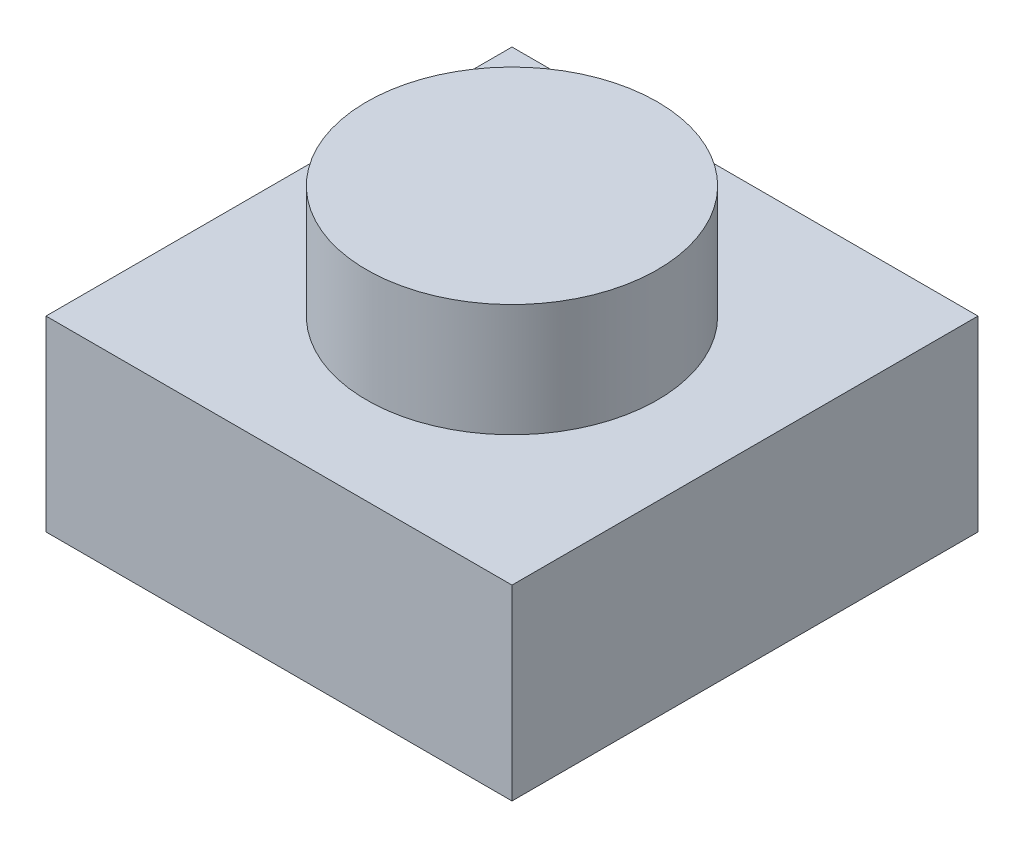
ISO-10303-21;
HEADER;
FILE_DESCRIPTION(('STEP AP214'),'2;1');
FILE_NAME('part.step','',(''),(''),'','','');
FILE_SCHEMA(('AUTOMOTIVE_DESIGN { 1 0 10303 214 1 1 1 1 }'));
ENDSEC;
DATA;
#1=APPLICATION_CONTEXT('core data for automotive mechanical design processes');
#2=APPLICATION_PROTOCOL_DEFINITION('international standard','automotive_design',2000,#1);
#3=PRODUCT_CONTEXT('',#1,'mechanical');
#4=PRODUCT('Part','Part','',(#3));
#5=PRODUCT_RELATED_PRODUCT_CATEGORY('part','',(#4));
#6=PRODUCT_DEFINITION_FORMATION('','',#4);
#7=PRODUCT_DEFINITION_CONTEXT('part definition',#1,'design');
#8=PRODUCT_DEFINITION('design','',#6,#7);
#9=PRODUCT_DEFINITION_SHAPE('','',#8);
#10=(LENGTH_UNIT() NAMED_UNIT(*) SI_UNIT(.MILLI.,.METRE.));
#11=(NAMED_UNIT(*) PLANE_ANGLE_UNIT() SI_UNIT($,.RADIAN.));
#12=(NAMED_UNIT(*) SI_UNIT($,.STERADIAN.) SOLID_ANGLE_UNIT());
#13=UNCERTAINTY_MEASURE_WITH_UNIT(LENGTH_MEASURE(1.E-05),#10,'distance_accuracy_value','');
#14=(GEOMETRIC_REPRESENTATION_CONTEXT(3) GLOBAL_UNCERTAINTY_ASSIGNED_CONTEXT((#13)) GLOBAL_UNIT_ASSIGNED_CONTEXT((#10,
#11,#12)) REPRESENTATION_CONTEXT('',''));
#15=CARTESIAN_POINT('',(0.,0.,0.));
#16=DIRECTION('',(0.,0.,1.));
#17=DIRECTION('',(1.,0.,0.));
#18=AXIS2_PLACEMENT_3D('',#15,#16,#17);
#19=CARTESIAN_POINT('',(3.925,-3.15,-3.925));
#20=DIRECTION('',(1.,0.,0.));
#21=DIRECTION('',(0.,0.,-1.));
#22=AXIS2_PLACEMENT_3D('',#19,#20,#21);
#23=PLANE('',#22);
#24=DIRECTION('',(0.,0.,-1.));
#25=VECTOR('',#24,1.);
#26=CARTESIAN_POINT('',(3.925,0.,-3.925));
#27=LINE('',#26,#25);
#28=CARTESIAN_POINT('',(3.925,0.,3.925));
#29=VERTEX_POINT('',#28);
#30=CARTESIAN_POINT('',(3.925,0.,-3.925));
#31=VERTEX_POINT('',#30);
#32=EDGE_CURVE('E154',#29,#31,#27,.T.);
#33=ORIENTED_EDGE('',*,*,#32,.F.);
#34=DIRECTION('',(0.,1.,0.));
#35=VECTOR('',#34,1.);
#36=CARTESIAN_POINT('',(3.925,-3.15,3.925));
#37=LINE('',#36,#35);
#38=CARTESIAN_POINT('',(3.925,-3.15,3.925));
#39=VERTEX_POINT('',#38);
#40=EDGE_CURVE('E41',#39,#29,#37,.T.);
#41=ORIENTED_EDGE('',*,*,#40,.F.);
#42=DIRECTION('',(0.,0.,-1.));
#43=VECTOR('',#42,1.);
#44=CARTESIAN_POINT('',(3.925,-3.15,-3.925));
#45=LINE('',#44,#43);
#46=CARTESIAN_POINT('',(3.925,-3.15,-3.925));
#47=VERTEX_POINT('',#46);
#48=EDGE_CURVE('E156',#39,#47,#45,.T.);
#49=ORIENTED_EDGE('',*,*,#48,.T.);
#50=DIRECTION('',(0.,1.,0.));
#51=VECTOR('',#50,1.);
#52=CARTESIAN_POINT('',(3.925,-3.15,-3.925));
#53=LINE('',#52,#51);
#54=EDGE_CURVE('E36',#47,#31,#53,.T.);
#55=ORIENTED_EDGE('',*,*,#54,.T.);
#56=EDGE_LOOP('',(#33,#41,#49,#55));
#57=FACE_BOUND('',#56,.T.);
#58=ADVANCED_FACE('F33',(#57),#23,.T.);
#59=CARTESIAN_POINT('',(-3.925,-3.15,3.925));
#60=DIRECTION('',(0.,0.,1.));
#61=DIRECTION('',(1.,0.,0.));
#62=AXIS2_PLACEMENT_3D('',#59,#60,#61);
#63=PLANE('',#62);
#64=DIRECTION('',(1.,0.,0.));
#65=VECTOR('',#64,1.);
#66=CARTESIAN_POINT('',(-3.925,0.,3.925));
#67=LINE('',#66,#65);
#68=CARTESIAN_POINT('',(-3.925,0.,3.925));
#69=VERTEX_POINT('',#68);
#70=EDGE_CURVE('E159',#69,#29,#67,.T.);
#71=ORIENTED_EDGE('',*,*,#70,.F.);
#72=DIRECTION('',(0.,1.,0.));
#73=VECTOR('',#72,1.);
#74=CARTESIAN_POINT('',(-3.925,-3.15,3.925));
#75=LINE('',#74,#73);
#76=CARTESIAN_POINT('',(-3.925,-3.15,3.925));
#77=VERTEX_POINT('',#76);
#78=EDGE_CURVE('E177',#77,#69,#75,.T.);
#79=ORIENTED_EDGE('',*,*,#78,.F.);
#80=DIRECTION('',(1.,0.,0.));
#81=VECTOR('',#80,1.);
#82=CARTESIAN_POINT('',(-3.925,-3.15,3.925));
#83=LINE('',#82,#81);
#84=EDGE_CURVE('E164',#77,#39,#83,.T.);
#85=ORIENTED_EDGE('',*,*,#84,.T.);
#86=ORIENTED_EDGE('',*,*,#40,.T.);
#87=EDGE_LOOP('',(#71,#79,#85,#86));
#88=FACE_BOUND('',#87,.T.);
#89=ADVANCED_FACE('F183',(#88),#63,.T.);
#90=CARTESIAN_POINT('',(-3.925,-3.15,-3.925));
#91=DIRECTION('',(-1.,0.,0.));
#92=DIRECTION('',(0.,0.,1.));
#93=AXIS2_PLACEMENT_3D('',#90,#91,#92);
#94=PLANE('',#93);
#95=DIRECTION('',(0.,0.,1.));
#96=VECTOR('',#95,1.);
#97=CARTESIAN_POINT('',(-3.925,0.,-3.925));
#98=LINE('',#97,#96);
#99=CARTESIAN_POINT('',(-3.925,0.,-3.925));
#100=VERTEX_POINT('',#99);
#101=EDGE_CURVE('E171',#100,#69,#98,.T.);
#102=ORIENTED_EDGE('',*,*,#101,.F.);
#103=DIRECTION('',(0.,1.,0.));
#104=VECTOR('',#103,1.);
#105=CARTESIAN_POINT('',(-3.925,-3.15,-3.925));
#106=LINE('',#105,#104);
#107=CARTESIAN_POINT('',(-3.925,-3.15,-3.925));
#108=VERTEX_POINT('',#107);
#109=EDGE_CURVE('E178',#108,#100,#106,.T.);
#110=ORIENTED_EDGE('',*,*,#109,.F.);
#111=DIRECTION('',(0.,0.,1.));
#112=VECTOR('',#111,1.);
#113=CARTESIAN_POINT('',(-3.925,-3.15,-3.925));
#114=LINE('',#113,#112);
#115=EDGE_CURVE('E161',#108,#77,#114,.T.);
#116=ORIENTED_EDGE('',*,*,#115,.T.);
#117=ORIENTED_EDGE('',*,*,#78,.T.);
#118=EDGE_LOOP('',(#102,#110,#116,#117));
#119=FACE_BOUND('',#118,.T.);
#120=ADVANCED_FACE('F187',(#119),#94,.T.);
#121=CARTESIAN_POINT('',(-3.925,-3.15,-3.925));
#122=DIRECTION('',(0.,0.,-1.));
#123=DIRECTION('',(-1.,0.,0.));
#124=AXIS2_PLACEMENT_3D('',#121,#122,#123);
#125=PLANE('',#124);
#126=DIRECTION('',(-1.,0.,0.));
#127=VECTOR('',#126,1.);
#128=CARTESIAN_POINT('',(-3.925,0.,-3.925));
#129=LINE('',#128,#127);
#130=EDGE_CURVE('E168',#31,#100,#129,.T.);
#131=ORIENTED_EDGE('',*,*,#130,.F.);
#132=ORIENTED_EDGE('',*,*,#54,.F.);
#133=DIRECTION('',(-1.,0.,0.));
#134=VECTOR('',#133,1.);
#135=CARTESIAN_POINT('',(-3.925,-3.15,-3.925));
#136=LINE('',#135,#134);
#137=EDGE_CURVE('E158',#47,#108,#136,.T.);
#138=ORIENTED_EDGE('',*,*,#137,.T.);
#139=ORIENTED_EDGE('',*,*,#109,.T.);
#140=EDGE_LOOP('',(#131,#132,#138,#139));
#141=FACE_BOUND('',#140,.T.);
#142=ADVANCED_FACE('F180',(#141),#125,.T.);
#143=CARTESIAN_POINT('',(0.,-3.15,0.));
#144=DIRECTION('',(0.,1.,0.));
#145=DIRECTION('',(0.,0.,1.));
#146=AXIS2_PLACEMENT_3D('',#143,#144,#145);
#147=PLANE('',#146);
#148=DIRECTION('',(1.,0.,0.));
#149=VECTOR('',#148,1.);
#150=CARTESIAN_POINT('',(0.,-3.15,2.425));
#151=LINE('',#150,#149);
#152=CARTESIAN_POINT('',(-2.425,-3.15,2.425));
#153=VERTEX_POINT('',#152);
#154=CARTESIAN_POINT('',(2.425,-3.15,2.425));
#155=VERTEX_POINT('',#154);
#156=EDGE_CURVE('E148',#153,#155,#151,.T.);
#157=ORIENTED_EDGE('',*,*,#156,.T.);
#158=DIRECTION('',(0.,0.,-1.));
#159=VECTOR('',#158,1.);
#160=CARTESIAN_POINT('',(2.425,-3.15,0.));
#161=LINE('',#160,#159);
#162=CARTESIAN_POINT('',(2.425,-3.15,-2.425));
#163=VERTEX_POINT('',#162);
#164=EDGE_CURVE('E111',#155,#163,#161,.T.);
#165=ORIENTED_EDGE('',*,*,#164,.T.);
#166=DIRECTION('',(-1.,0.,0.));
#167=VECTOR('',#166,1.);
#168=CARTESIAN_POINT('',(0.,-3.15,-2.425));
#169=LINE('',#168,#167);
#170=CARTESIAN_POINT('',(-2.425,-3.15,-2.425));
#171=VERTEX_POINT('',#170);
#172=EDGE_CURVE('E133',#163,#171,#169,.T.);
#173=ORIENTED_EDGE('',*,*,#172,.T.);
#174=DIRECTION('',(0.,0.,1.));
#175=VECTOR('',#174,1.);
#176=CARTESIAN_POINT('',(-2.425,-3.15,0.));
#177=LINE('',#176,#175);
#178=EDGE_CURVE('E49',#171,#153,#177,.T.);
#179=ORIENTED_EDGE('',*,*,#178,.T.);
#180=EDGE_LOOP('',(#157,#165,#173,#179));
#181=FACE_BOUND('',#180,.T.);
#182=ORIENTED_EDGE('',*,*,#48,.F.);
#183=ORIENTED_EDGE('',*,*,#84,.F.);
#184=ORIENTED_EDGE('',*,*,#115,.F.);
#185=ORIENTED_EDGE('',*,*,#137,.F.);
#186=EDGE_LOOP('',(#182,#183,#184,#185));
#187=FACE_BOUND('',#186,.T.);
#188=ADVANCED_FACE('F189',(#181,#187),#147,.F.);
#189=CARTESIAN_POINT('',(0.,0.,0.));
#190=DIRECTION('',(0.,1.,0.));
#191=DIRECTION('',(0.,0.,1.));
#192=AXIS2_PLACEMENT_3D('',#189,#190,#191);
#193=PLANE('',#192);
#194=CARTESIAN_POINT('',(0.,0.,0.));
#195=DIRECTION('',(0.,1.,0.));
#196=DIRECTION('',(0.,0.,1.));
#197=AXIS2_PLACEMENT_3D('',#194,#195,#196);
#198=CIRCLE('',#197,2.45);
#199=CARTESIAN_POINT('',(0.,0.,-2.45));
#200=VERTEX_POINT('',#199);
#201=EDGE_CURVE('E11',#200,#200,#198,.T.);
#202=ORIENTED_EDGE('',*,*,#201,.F.);
#203=EDGE_LOOP('',(#202));
#204=FACE_BOUND('',#203,.T.);
#205=ORIENTED_EDGE('',*,*,#32,.T.);
#206=ORIENTED_EDGE('',*,*,#130,.T.);
#207=ORIENTED_EDGE('',*,*,#101,.T.);
#208=ORIENTED_EDGE('',*,*,#70,.T.);
#209=EDGE_LOOP('',(#205,#206,#207,#208));
#210=FACE_BOUND('',#209,.T.);
#211=ADVANCED_FACE('F182',(#204,#210),#193,.T.);
#212=CARTESIAN_POINT('',(0.,1.9,0.));
#213=DIRECTION('',(0.,-1.,0.));
#214=DIRECTION('',(0.,0.,-1.));
#215=AXIS2_PLACEMENT_3D('',#212,#213,#214);
#216=CYLINDRICAL_SURFACE('',#215,2.45);
#217=CARTESIAN_POINT('',(0.,1.9,0.));
#218=DIRECTION('',(0.,1.,0.));
#219=DIRECTION('',(0.,0.,1.));
#220=AXIS2_PLACEMENT_3D('',#217,#218,#219);
#221=CIRCLE('',#220,2.45);
#222=CARTESIAN_POINT('',(0.,1.9,-2.45));
#223=VERTEX_POINT('',#222);
#224=EDGE_CURVE('E145',#223,#223,#221,.T.);
#225=CARTESIAN_POINT('',(0.,1.9,-2.45));
#226=CARTESIAN_POINT('',(0.,1.88020833333333,-2.45));
#227=CARTESIAN_POINT('',(0.,1.86041666666667,-2.45));
#228=CARTESIAN_POINT('',(0.,1.82083333333333,-2.45));
#229=CARTESIAN_POINT('',(0.,1.80104166666667,-2.45));
#230=CARTESIAN_POINT('',(0.,1.76145833333333,-2.45));
#231=CARTESIAN_POINT('',(0.,1.74166666666667,-2.45));
#232=CARTESIAN_POINT('',(0.,1.70208333333333,-2.45));
#233=CARTESIAN_POINT('',(0.,1.68229166666667,-2.45));
#234=CARTESIAN_POINT('',(0.,1.64270833333333,-2.45));
#235=CARTESIAN_POINT('',(0.,1.62291666666667,-2.45));
#236=CARTESIAN_POINT('',(0.,1.58333333333333,-2.45));
#237=CARTESIAN_POINT('',(0.,1.56354166666667,-2.45));
#238=CARTESIAN_POINT('',(0.,1.52395833333333,-2.45));
#239=CARTESIAN_POINT('',(0.,1.50416666666667,-2.45));
#240=CARTESIAN_POINT('',(0.,1.46458333333333,-2.45));
#241=CARTESIAN_POINT('',(0.,1.44479166666667,-2.45));
#242=CARTESIAN_POINT('',(0.,1.40520833333333,-2.45));
#243=CARTESIAN_POINT('',(0.,1.38541666666667,-2.45));
#244=CARTESIAN_POINT('',(0.,1.34583333333333,-2.45));
#245=CARTESIAN_POINT('',(0.,1.32604166666667,-2.45));
#246=CARTESIAN_POINT('',(0.,1.28645833333333,-2.45));
#247=CARTESIAN_POINT('',(0.,1.26666666666667,-2.45));
#248=CARTESIAN_POINT('',(0.,1.22708333333333,-2.45));
#249=CARTESIAN_POINT('',(0.,1.20729166666667,-2.45));
#250=CARTESIAN_POINT('',(0.,1.16770833333333,-2.45));
#251=CARTESIAN_POINT('',(0.,1.14791666666667,-2.45));
#252=CARTESIAN_POINT('',(0.,1.10833333333333,-2.45));
#253=CARTESIAN_POINT('',(0.,1.08854166666667,-2.45));
#254=CARTESIAN_POINT('',(0.,1.04895833333333,-2.45));
#255=CARTESIAN_POINT('',(0.,1.02916666666667,-2.45));
#256=CARTESIAN_POINT('',(0.,0.989583333333333,-2.45));
#257=CARTESIAN_POINT('',(0.,0.969791666666667,-2.45));
#258=CARTESIAN_POINT('',(0.,0.930208333333333,-2.45));
#259=CARTESIAN_POINT('',(0.,0.910416666666667,-2.45));
#260=CARTESIAN_POINT('',(0.,0.870833333333333,-2.45));
#261=CARTESIAN_POINT('',(0.,0.851041666666667,-2.45));
#262=CARTESIAN_POINT('',(0.,0.811458333333333,-2.45));
#263=CARTESIAN_POINT('',(0.,0.791666666666667,-2.45));
#264=CARTESIAN_POINT('',(0.,0.752083333333333,-2.45));
#265=CARTESIAN_POINT('',(0.,0.732291666666667,-2.45));
#266=CARTESIAN_POINT('',(0.,0.692708333333333,-2.45));
#267=CARTESIAN_POINT('',(0.,0.672916666666667,-2.45));
#268=CARTESIAN_POINT('',(0.,0.633333333333333,-2.45));
#269=CARTESIAN_POINT('',(0.,0.613541666666667,-2.45));
#270=CARTESIAN_POINT('',(0.,0.573958333333333,-2.45));
#271=CARTESIAN_POINT('',(0.,0.554166666666667,-2.45));
#272=CARTESIAN_POINT('',(0.,0.514583333333333,-2.45));
#273=CARTESIAN_POINT('',(0.,0.494791666666667,-2.45));
#274=CARTESIAN_POINT('',(0.,0.455208333333333,-2.45));
#275=CARTESIAN_POINT('',(0.,0.435416666666667,-2.45));
#276=CARTESIAN_POINT('',(0.,0.395833333333333,-2.45));
#277=CARTESIAN_POINT('',(0.,0.376041666666667,-2.45));
#278=CARTESIAN_POINT('',(0.,0.336458333333333,-2.45));
#279=CARTESIAN_POINT('',(0.,0.316666666666667,-2.45));
#280=CARTESIAN_POINT('',(0.,0.277083333333333,-2.45));
#281=CARTESIAN_POINT('',(0.,0.257291666666667,-2.45));
#282=CARTESIAN_POINT('',(0.,0.217708333333333,-2.45));
#283=CARTESIAN_POINT('',(0.,0.197916666666667,-2.45));
#284=CARTESIAN_POINT('',(0.,0.158333333333333,-2.45));
#285=CARTESIAN_POINT('',(0.,0.138541666666667,-2.45));
#286=CARTESIAN_POINT('',(0.,0.0989583333333333,-2.45));
#287=CARTESIAN_POINT('',(0.,0.0791666666666666,-2.45));
#288=CARTESIAN_POINT('',(0.,0.0395833333333333,-2.45));
#289=CARTESIAN_POINT('',(0.,0.0197916666666666,-2.45));
#290=CARTESIAN_POINT('',(0.,0.,-2.45));
#291=B_SPLINE_CURVE_WITH_KNOTS('',3,(#225,#226,#227,#228,#229,#230,#231,#232,#233,#234,#235,
#236,#237,#238,#239,#240,#241,#242,#243,#244,#245,#246,#247,#248,#249,#250,#251,#252,#253,#254,
#255,#256,#257,#258,#259,#260,#261,#262,#263,#264,#265,#266,#267,#268,#269,#270,#271,#272,#273,
#274,#275,#276,#277,#278,#279,#280,#281,#282,#283,#284,#285,#286,#287,#288,#289,#290),
.UNSPECIFIED.,.F.,.F.,(4,2,2,2,2,2,2,2,2,2,2,2,2,2,2,2,2,2,2,2,2,2,2,2,2,2,2,2,2,2,2,2,4),(0.,
0.059375,0.11875,0.178125,0.2375,0.296875,0.35625,0.415625,0.475,0.534375,0.59375,0.653125,
0.7125,0.771875,0.83125,0.890625,0.95,1.009375,1.06875,1.128125,1.1875,1.246875,1.30625,
1.365625,1.425,1.484375,1.54375,1.603125,1.6625,1.721875,1.78125,1.840625,1.9),.UNSPECIFIED.);
#292=EDGE_CURVE('BSEAM197',#223,#200,#291,.T.);
#293=ORIENTED_EDGE('',*,*,#224,.F.);
#294=ORIENTED_EDGE('',*,*,#201,.T.);
#295=ORIENTED_EDGE('',*,*,#292,.T.);
#296=ORIENTED_EDGE('',*,*,#292,.F.);
#297=EDGE_LOOP('',(#293,#295,#294,#296));
#298=FACE_BOUND('',#297,.T.);
#299=ADVANCED_FACE('F197',(#298),#216,.T.);
#300=CARTESIAN_POINT('',(0.,1.9,0.));
#301=DIRECTION('',(0.,1.,0.));
#302=DIRECTION('',(0.,0.,1.));
#303=AXIS2_PLACEMENT_3D('',#300,#301,#302);
#304=PLANE('',#303);
#305=ORIENTED_EDGE('',*,*,#224,.T.);
#306=EDGE_LOOP('',(#305));
#307=FACE_BOUND('',#306,.T.);
#308=ADVANCED_FACE('F232',(#307),#304,.T.);
#309=CARTESIAN_POINT('',(2.425,-3.15,-3.925));
#310=DIRECTION('',(1.,0.,0.));
#311=DIRECTION('',(0.,0.,-1.));
#312=AXIS2_PLACEMENT_3D('',#309,#310,#311);
#313=PLANE('',#312);
#314=DIRECTION('',(0.,0.,-1.));
#315=VECTOR('',#314,1.);
#316=CARTESIAN_POINT('',(2.425,-1.5,0.));
#317=LINE('',#316,#315);
#318=CARTESIAN_POINT('',(2.425,-1.5,2.425));
#319=VERTEX_POINT('',#318);
#320=CARTESIAN_POINT('',(2.425,-1.5,-2.425));
#321=VERTEX_POINT('',#320);
#322=EDGE_CURVE('E109',#319,#321,#317,.T.);
#323=ORIENTED_EDGE('',*,*,#322,.T.);
#324=DIRECTION('',(0.,1.,0.));
#325=VECTOR('',#324,1.);
#326=CARTESIAN_POINT('',(2.425,-3.15,-2.425));
#327=LINE('',#326,#325);
#328=EDGE_CURVE('E138',#163,#321,#327,.T.);
#329=ORIENTED_EDGE('',*,*,#328,.F.);
#330=ORIENTED_EDGE('',*,*,#164,.F.);
#331=DIRECTION('',(0.,1.,0.));
#332=VECTOR('',#331,1.);
#333=CARTESIAN_POINT('',(2.425,-3.15,2.425));
#334=LINE('',#333,#332);
#335=EDGE_CURVE('E106',#155,#319,#334,.T.);
#336=ORIENTED_EDGE('',*,*,#335,.T.);
#337=EDGE_LOOP('',(#323,#329,#330,#336));
#338=FACE_BOUND('',#337,.T.);
#339=ADVANCED_FACE('F108',(#338),#313,.F.);
#340=CARTESIAN_POINT('',(-3.925,-3.15,2.425));
#341=DIRECTION('',(0.,0.,1.));
#342=DIRECTION('',(1.,0.,0.));
#343=AXIS2_PLACEMENT_3D('',#340,#341,#342);
#344=PLANE('',#343);
#345=DIRECTION('',(1.,0.,0.));
#346=VECTOR('',#345,1.);
#347=CARTESIAN_POINT('',(0.,-1.5,2.425));
#348=LINE('',#347,#346);
#349=CARTESIAN_POINT('',(-2.425,-1.5,2.425));
#350=VERTEX_POINT('',#349);
#351=EDGE_CURVE('E124',#350,#319,#348,.T.);
#352=ORIENTED_EDGE('',*,*,#351,.T.);
#353=ORIENTED_EDGE('',*,*,#335,.F.);
#354=ORIENTED_EDGE('',*,*,#156,.F.);
#355=DIRECTION('',(0.,1.,0.));
#356=VECTOR('',#355,1.);
#357=CARTESIAN_POINT('',(-2.425,-3.15,2.425));
#358=LINE('',#357,#356);
#359=EDGE_CURVE('E117',#153,#350,#358,.T.);
#360=ORIENTED_EDGE('',*,*,#359,.T.);
#361=EDGE_LOOP('',(#352,#353,#354,#360));
#362=FACE_BOUND('',#361,.T.);
#363=ADVANCED_FACE('F129',(#362),#344,.F.);
#364=CARTESIAN_POINT('',(-2.425,-3.15,-3.925));
#365=DIRECTION('',(-1.,0.,0.));
#366=DIRECTION('',(0.,0.,1.));
#367=AXIS2_PLACEMENT_3D('',#364,#365,#366);
#368=PLANE('',#367);
#369=DIRECTION('',(0.,0.,1.));
#370=VECTOR('',#369,1.);
#371=CARTESIAN_POINT('',(-2.425,-1.5,0.));
#372=LINE('',#371,#370);
#373=CARTESIAN_POINT('',(-2.425,-1.5,-2.425));
#374=VERTEX_POINT('',#373);
#375=EDGE_CURVE('E131',#374,#350,#372,.T.);
#376=ORIENTED_EDGE('',*,*,#375,.T.);
#377=ORIENTED_EDGE('',*,*,#359,.F.);
#378=ORIENTED_EDGE('',*,*,#178,.F.);
#379=DIRECTION('',(0.,1.,0.));
#380=VECTOR('',#379,1.);
#381=CARTESIAN_POINT('',(-2.425,-3.15,-2.425));
#382=LINE('',#381,#380);
#383=EDGE_CURVE('E139',#171,#374,#382,.T.);
#384=ORIENTED_EDGE('',*,*,#383,.T.);
#385=EDGE_LOOP('',(#376,#377,#378,#384));
#386=FACE_BOUND('',#385,.T.);
#387=ADVANCED_FACE('F261',(#386),#368,.F.);
#388=CARTESIAN_POINT('',(-3.925,-3.15,-2.425));
#389=DIRECTION('',(0.,0.,-1.));
#390=DIRECTION('',(-1.,0.,0.));
#391=AXIS2_PLACEMENT_3D('',#388,#389,#390);
#392=PLANE('',#391);
#393=DIRECTION('',(-1.,0.,0.));
#394=VECTOR('',#393,1.);
#395=CARTESIAN_POINT('',(0.,-1.5,-2.425));
#396=LINE('',#395,#394);
#397=EDGE_CURVE('E126',#321,#374,#396,.T.);
#398=ORIENTED_EDGE('',*,*,#397,.T.);
#399=ORIENTED_EDGE('',*,*,#383,.F.);
#400=ORIENTED_EDGE('',*,*,#172,.F.);
#401=ORIENTED_EDGE('',*,*,#328,.T.);
#402=EDGE_LOOP('',(#398,#399,#400,#401));
#403=FACE_BOUND('',#402,.T.);
#404=ADVANCED_FACE('F270',(#403),#392,.F.);
#405=CARTESIAN_POINT('',(0.,-1.5,0.));
#406=DIRECTION('',(0.,1.,0.));
#407=DIRECTION('',(0.,0.,1.));
#408=AXIS2_PLACEMENT_3D('',#405,#406,#407);
#409=PLANE('',#408);
#410=CARTESIAN_POINT('',(0.,-1.5,0.));
#411=DIRECTION('',(0.,1.,0.));
#412=DIRECTION('',(0.,0.,1.));
#413=AXIS2_PLACEMENT_3D('',#410,#411,#412);
#414=CIRCLE('',#413,0.950000000000001);
#415=CARTESIAN_POINT('',(0.,-1.5,-0.950000000000001));
#416=VERTEX_POINT('',#415);
#417=EDGE_CURVE('E116',#416,#416,#414,.T.);
#418=ORIENTED_EDGE('',*,*,#417,.T.);
#419=EDGE_LOOP('',(#418));
#420=FACE_BOUND('',#419,.T.);
#421=ORIENTED_EDGE('',*,*,#322,.F.);
#422=ORIENTED_EDGE('',*,*,#351,.F.);
#423=ORIENTED_EDGE('',*,*,#375,.F.);
#424=ORIENTED_EDGE('',*,*,#397,.F.);
#425=EDGE_LOOP('',(#421,#422,#423,#424));
#426=FACE_BOUND('',#425,.T.);
#427=ADVANCED_FACE('F122',(#420,#426),#409,.F.);
#428=CARTESIAN_POINT('',(0.,1.9,0.));
#429=DIRECTION('',(0.,-1.,0.));
#430=DIRECTION('',(0.,0.,-1.));
#431=AXIS2_PLACEMENT_3D('',#428,#429,#430);
#432=CYLINDRICAL_SURFACE('',#431,0.950000000000001);
#433=CARTESIAN_POINT('',(0.,0.4,0.));
#434=DIRECTION('',(0.,1.,0.));
#435=DIRECTION('',(0.,0.,1.));
#436=AXIS2_PLACEMENT_3D('',#433,#434,#435);
#437=CIRCLE('',#436,0.950000000000001);
#438=CARTESIAN_POINT('',(0.,0.4,-0.950000000000001));
#439=VERTEX_POINT('',#438);
#440=EDGE_CURVE('E127',#439,#439,#437,.T.);
#441=CARTESIAN_POINT('',(0.,0.4,-0.950000000000001));
#442=CARTESIAN_POINT('',(0.,0.380208333333333,-0.950000000000001));
#443=CARTESIAN_POINT('',(0.,0.360416666666666,-0.950000000000001));
#444=CARTESIAN_POINT('',(0.,0.320833333333333,-0.950000000000001));
#445=CARTESIAN_POINT('',(0.,0.301041666666666,-0.950000000000001));
#446=CARTESIAN_POINT('',(0.,0.261458333333333,-0.950000000000001));
#447=CARTESIAN_POINT('',(0.,0.241666666666666,-0.950000000000001));
#448=CARTESIAN_POINT('',(0.,0.202083333333333,-0.950000000000001));
#449=CARTESIAN_POINT('',(0.,0.182291666666666,-0.950000000000001));
#450=CARTESIAN_POINT('',(0.,0.142708333333333,-0.950000000000001));
#451=CARTESIAN_POINT('',(0.,0.122916666666666,-0.950000000000001));
#452=CARTESIAN_POINT('',(0.,0.083333333333333,-0.950000000000001));
#453=CARTESIAN_POINT('',(0.,0.0635416666666663,-0.950000000000001));
#454=CARTESIAN_POINT('',(0.,0.0239583333333329,-0.950000000000001));
#455=CARTESIAN_POINT('',(0.,0.00416666666666621,-0.950000000000001));
#456=CARTESIAN_POINT('',(0.,-0.035416666666667,-0.950000000000001));
#457=CARTESIAN_POINT('',(0.,-0.0552083333333336,-0.950000000000001));
#458=CARTESIAN_POINT('',(0.,-0.0947916666666669,-0.950000000000001));
#459=CARTESIAN_POINT('',(0.,-0.114583333333334,-0.950000000000001));
#460=CARTESIAN_POINT('',(0.,-0.154166666666667,-0.950000000000001));
#461=CARTESIAN_POINT('',(0.,-0.173958333333333,-0.950000000000001));
#462=CARTESIAN_POINT('',(0.,-0.213541666666667,-0.950000000000001));
#463=CARTESIAN_POINT('',(0.,-0.233333333333333,-0.950000000000001));
#464=CARTESIAN_POINT('',(0.,-0.272916666666667,-0.950000000000001));
#465=CARTESIAN_POINT('',(0.,-0.292708333333334,-0.950000000000001));
#466=CARTESIAN_POINT('',(0.,-0.332291666666667,-0.950000000000001));
#467=CARTESIAN_POINT('',(0.,-0.352083333333334,-0.950000000000001));
#468=CARTESIAN_POINT('',(0.,-0.391666666666667,-0.950000000000001));
#469=CARTESIAN_POINT('',(0.,-0.411458333333334,-0.950000000000001));
#470=CARTESIAN_POINT('',(0.,-0.451041666666667,-0.950000000000001));
#471=CARTESIAN_POINT('',(0.,-0.470833333333334,-0.950000000000001));
#472=CARTESIAN_POINT('',(0.,-0.510416666666667,-0.950000000000001));
#473=CARTESIAN_POINT('',(0.,-0.530208333333334,-0.950000000000001));
#474=CARTESIAN_POINT('',(0.,-0.569791666666667,-0.950000000000001));
#475=CARTESIAN_POINT('',(0.,-0.589583333333334,-0.950000000000001));
#476=CARTESIAN_POINT('',(0.,-0.629166666666667,-0.950000000000001));
#477=CARTESIAN_POINT('',(0.,-0.648958333333334,-0.950000000000001));
#478=CARTESIAN_POINT('',(0.,-0.688541666666667,-0.950000000000001));
#479=CARTESIAN_POINT('',(0.,-0.708333333333334,-0.950000000000001));
#480=CARTESIAN_POINT('',(0.,-0.747916666666667,-0.950000000000001));
#481=CARTESIAN_POINT('',(0.,-0.767708333333334,-0.950000000000001));
#482=CARTESIAN_POINT('',(0.,-0.807291666666667,-0.950000000000001));
#483=CARTESIAN_POINT('',(0.,-0.827083333333334,-0.950000000000001));
#484=CARTESIAN_POINT('',(0.,-0.866666666666667,-0.950000000000001));
#485=CARTESIAN_POINT('',(0.,-0.886458333333334,-0.950000000000001));
#486=CARTESIAN_POINT('',(0.,-0.926041666666667,-0.950000000000001));
#487=CARTESIAN_POINT('',(0.,-0.945833333333334,-0.950000000000001));
#488=CARTESIAN_POINT('',(0.,-0.985416666666667,-0.950000000000001));
#489=CARTESIAN_POINT('',(0.,-1.00520833333333,-0.950000000000001));
#490=CARTESIAN_POINT('',(0.,-1.04479166666667,-0.950000000000001));
#491=CARTESIAN_POINT('',(0.,-1.06458333333333,-0.950000000000001));
#492=CARTESIAN_POINT('',(0.,-1.10416666666667,-0.950000000000001));
#493=CARTESIAN_POINT('',(0.,-1.12395833333333,-0.950000000000001));
#494=CARTESIAN_POINT('',(0.,-1.16354166666667,-0.950000000000001));
#495=CARTESIAN_POINT('',(0.,-1.18333333333333,-0.950000000000001));
#496=CARTESIAN_POINT('',(0.,-1.22291666666667,-0.950000000000001));
#497=CARTESIAN_POINT('',(0.,-1.24270833333333,-0.950000000000001));
#498=CARTESIAN_POINT('',(0.,-1.28229166666667,-0.950000000000001));
#499=CARTESIAN_POINT('',(0.,-1.30208333333333,-0.950000000000001));
#500=CARTESIAN_POINT('',(0.,-1.34166666666667,-0.950000000000001));
#501=CARTESIAN_POINT('',(0.,-1.36145833333333,-0.950000000000001));
#502=CARTESIAN_POINT('',(0.,-1.40104166666667,-0.950000000000001));
#503=CARTESIAN_POINT('',(0.,-1.42083333333333,-0.950000000000001));
#504=CARTESIAN_POINT('',(0.,-1.46041666666667,-0.950000000000001));
#505=CARTESIAN_POINT('',(0.,-1.48020833333333,-0.950000000000001));
#506=CARTESIAN_POINT('',(0.,-1.5,-0.950000000000001));
#507=B_SPLINE_CURVE_WITH_KNOTS('',3,(#441,#442,#443,#444,#445,#446,#447,#448,#449,#450,#451,
#452,#453,#454,#455,#456,#457,#458,#459,#460,#461,#462,#463,#464,#465,#466,#467,#468,#469,#470,
#471,#472,#473,#474,#475,#476,#477,#478,#479,#480,#481,#482,#483,#484,#485,#486,#487,#488,#489,
#490,#491,#492,#493,#494,#495,#496,#497,#498,#499,#500,#501,#502,#503,#504,#505,#506),
.UNSPECIFIED.,.F.,.F.,(4,2,2,2,2,2,2,2,2,2,2,2,2,2,2,2,2,2,2,2,2,2,2,2,2,2,2,2,2,2,2,2,4),(0.,
0.059375,0.11875,0.178125,0.2375,0.296875,0.35625,0.415625,0.475,0.534375,0.59375,0.653125,
0.7125,0.771875,0.83125,0.890625,0.95,1.009375,1.06875,1.128125,1.1875,1.246875,1.30625,
1.365625,1.425,1.484375,1.54375,1.603125,1.6625,1.721875,1.78125,1.840625,1.9),.UNSPECIFIED.);
#508=EDGE_CURVE('BSEAM288',#439,#416,#507,.T.);
#509=ORIENTED_EDGE('',*,*,#440,.T.);
#510=ORIENTED_EDGE('',*,*,#417,.F.);
#511=ORIENTED_EDGE('',*,*,#508,.T.);
#512=ORIENTED_EDGE('',*,*,#508,.F.);
#513=EDGE_LOOP('',(#509,#511,#510,#512));
#514=FACE_BOUND('',#513,.T.);
#515=ADVANCED_FACE('F288',(#514),#432,.F.);
#516=CARTESIAN_POINT('',(0.,0.4,0.));
#517=DIRECTION('',(0.,1.,0.));
#518=DIRECTION('',(0.,0.,1.));
#519=AXIS2_PLACEMENT_3D('',#516,#517,#518);
#520=PLANE('',#519);
#521=ORIENTED_EDGE('',*,*,#440,.F.);
#522=EDGE_LOOP('',(#521));
#523=FACE_BOUND('',#522,.T.);
#524=ADVANCED_FACE('F298',(#523),#520,.F.);
#525=CLOSED_SHELL('',(#58,#89,#120,#142,#188,#211,#299,#308,#339,#363,#387,#404,#427,#515,#524));
#526=MANIFOLD_SOLID_BREP('B2',#525);
#527=ADVANCED_BREP_SHAPE_REPRESENTATION('',(#18,#526),#14);
#528=SHAPE_DEFINITION_REPRESENTATION(#9,#527);
ENDSEC;
END-ISO-10303-21;
